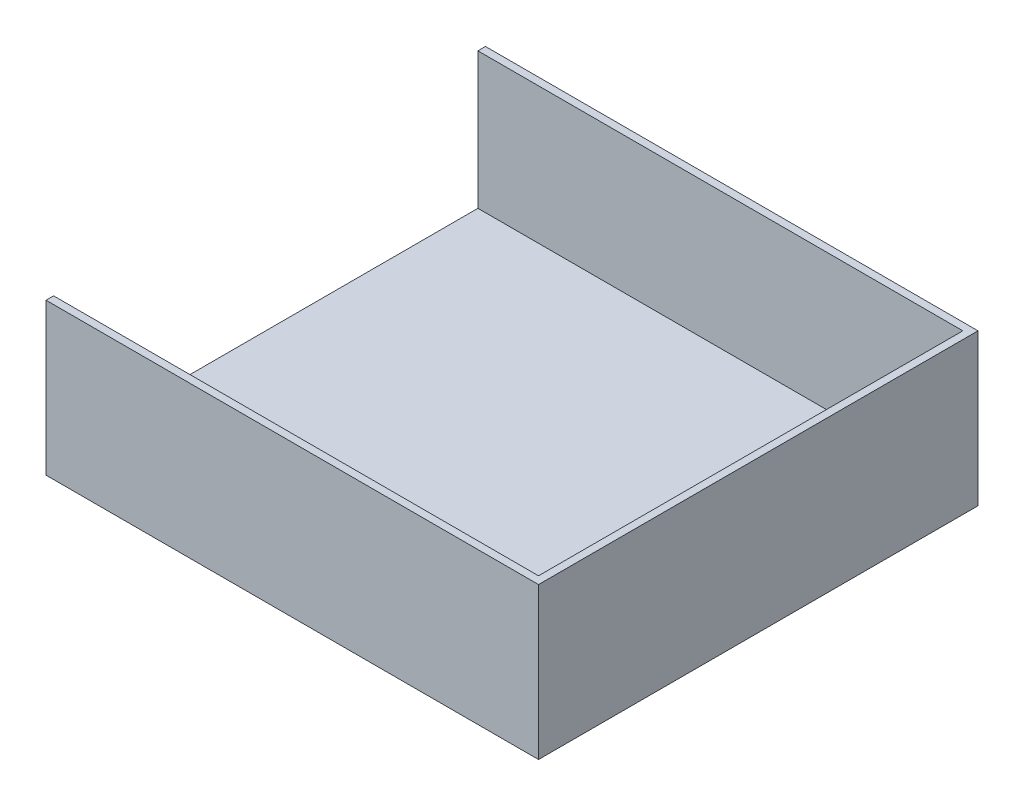
ISO-10303-21;
HEADER;
FILE_DESCRIPTION(('STEP AP214'),'2;1');
FILE_NAME('part.step','',(''),(''),'','','');
FILE_SCHEMA(('AUTOMOTIVE_DESIGN { 1 0 10303 214 1 1 1 1 }'));
ENDSEC;
DATA;
#1=APPLICATION_CONTEXT('core data for automotive mechanical design processes');
#2=APPLICATION_PROTOCOL_DEFINITION('international standard','automotive_design',2000,#1);
#3=PRODUCT_CONTEXT('',#1,'mechanical');
#4=PRODUCT('Part','Part','',(#3));
#5=PRODUCT_RELATED_PRODUCT_CATEGORY('part','',(#4));
#6=PRODUCT_DEFINITION_FORMATION('','',#4);
#7=PRODUCT_DEFINITION_CONTEXT('part definition',#1,'design');
#8=PRODUCT_DEFINITION('design','',#6,#7);
#9=PRODUCT_DEFINITION_SHAPE('','',#8);
#10=(LENGTH_UNIT() NAMED_UNIT(*) SI_UNIT(.MILLI.,.METRE.));
#11=(NAMED_UNIT(*) PLANE_ANGLE_UNIT() SI_UNIT($,.RADIAN.));
#12=(NAMED_UNIT(*) SI_UNIT($,.STERADIAN.) SOLID_ANGLE_UNIT());
#13=UNCERTAINTY_MEASURE_WITH_UNIT(LENGTH_MEASURE(1.E-05),#10,'distance_accuracy_value','');
#14=(GEOMETRIC_REPRESENTATION_CONTEXT(3) GLOBAL_UNCERTAINTY_ASSIGNED_CONTEXT((#13)) GLOBAL_UNIT_ASSIGNED_CONTEXT((#10,
#11,#12)) REPRESENTATION_CONTEXT('',''));
#15=CARTESIAN_POINT('',(0.,0.,0.));
#16=DIRECTION('',(0.,0.,1.));
#17=DIRECTION('',(1.,0.,0.));
#18=AXIS2_PLACEMENT_3D('',#15,#16,#17);
#19=CARTESIAN_POINT('',(0.,0.,0.));
#20=DIRECTION('',(1.,0.,0.));
#21=DIRECTION('',(0.,1.,0.));
#22=AXIS2_PLACEMENT_3D('',#19,#20,#21);
#23=PLANE('',#22);
#24=DIRECTION('',(0.,0.,1.));
#25=VECTOR('',#24,1.);
#26=CARTESIAN_POINT('',(0.,0.,0.));
#27=LINE('',#26,#25);
#28=CARTESIAN_POINT('',(0.,0.,-92.075));
#29=VERTEX_POINT('',#28);
#30=CARTESIAN_POINT('',(1.11022302462516E-13,0.,92.075));
#31=VERTEX_POINT('',#30);
#32=EDGE_CURVE('E45',#29,#31,#27,.T.);
#33=ORIENTED_EDGE('',*,*,#32,.T.);
#34=DIRECTION('',(0.,-1.,0.));
#35=VECTOR('',#34,1.);
#36=CARTESIAN_POINT('',(1.38777878078145E-13,63.4999999999997,92.075));
#37=LINE('',#36,#35);
#38=CARTESIAN_POINT('',(1.11022302462516E-13,63.5,92.075));
#39=VERTEX_POINT('',#38);
#40=EDGE_CURVE('E156',#39,#31,#37,.T.);
#41=ORIENTED_EDGE('',*,*,#40,.F.);
#42=DIRECTION('',(0.,0.,1.));
#43=VECTOR('',#42,1.);
#44=CARTESIAN_POINT('',(0.,63.5,0.));
#45=LINE('',#44,#43);
#46=CARTESIAN_POINT('',(1.11022302462516E-13,63.5,88.9));
#47=VERTEX_POINT('',#46);
#48=EDGE_CURVE('E162',#47,#39,#45,.T.);
#49=ORIENTED_EDGE('',*,*,#48,.F.);
#50=DIRECTION('',(0.,-1.,0.));
#51=VECTOR('',#50,1.);
#52=CARTESIAN_POINT('',(1.38777878078145E-13,63.4999999999997,88.9));
#53=LINE('',#52,#51);
#54=CARTESIAN_POINT('',(0.,6.35,88.9));
#55=VERTEX_POINT('',#54);
#56=EDGE_CURVE('E50',#47,#55,#53,.T.);
#57=ORIENTED_EDGE('',*,*,#56,.T.);
#58=DIRECTION('',(0.,0.,-1.));
#59=VECTOR('',#58,1.);
#60=CARTESIAN_POINT('',(0.,6.35,0.));
#61=LINE('',#60,#59);
#62=CARTESIAN_POINT('',(0.,6.35,-88.9));
#63=VERTEX_POINT('',#62);
#64=EDGE_CURVE('E11',#55,#63,#61,.T.);
#65=ORIENTED_EDGE('',*,*,#64,.T.);
#66=DIRECTION('',(0.,1.,0.));
#67=VECTOR('',#66,1.);
#68=CARTESIAN_POINT('',(0.,63.4999999999997,-88.9));
#69=LINE('',#68,#67);
#70=CARTESIAN_POINT('',(0.,63.5,-88.9));
#71=VERTEX_POINT('',#70);
#72=EDGE_CURVE('E64',#63,#71,#69,.T.);
#73=ORIENTED_EDGE('',*,*,#72,.T.);
#74=CARTESIAN_POINT('',(0.,63.5,-92.075));
#75=VERTEX_POINT('',#74);
#76=EDGE_CURVE('E160',#75,#71,#45,.T.);
#77=ORIENTED_EDGE('',*,*,#76,.F.);
#78=DIRECTION('',(0.,1.,0.));
#79=VECTOR('',#78,1.);
#80=CARTESIAN_POINT('',(0.,63.4999999999997,-92.075));
#81=LINE('',#80,#79);
#82=EDGE_CURVE('E163',#29,#75,#81,.T.);
#83=ORIENTED_EDGE('',*,*,#82,.F.);
#84=EDGE_LOOP('',(#33,#41,#49,#57,#65,#73,#77,#83));
#85=FACE_BOUND('',#84,.T.);
#86=ADVANCED_FACE('F42',(#85),#23,.F.);
#87=CARTESIAN_POINT('',(0.,63.5,0.));
#88=DIRECTION('',(0.,-1.,0.));
#89=DIRECTION('',(0.,0.,-1.));
#90=AXIS2_PLACEMENT_3D('',#87,#88,#89);
#91=PLANE('',#90);
#92=DIRECTION('',(-1.,0.,0.));
#93=VECTOR('',#92,1.);
#94=CARTESIAN_POINT('',(-206.375,63.5,-92.075));
#95=LINE('',#94,#93);
#96=CARTESIAN_POINT('',(206.375,63.5,-92.075));
#97=VERTEX_POINT('',#96);
#98=EDGE_CURVE('E139',#97,#75,#95,.T.);
#99=ORIENTED_EDGE('',*,*,#98,.T.);
#100=ORIENTED_EDGE('',*,*,#76,.T.);
#101=DIRECTION('',(-1.,0.,0.));
#102=VECTOR('',#101,1.);
#103=CARTESIAN_POINT('',(-203.2,63.5,-88.9));
#104=LINE('',#103,#102);
#105=CARTESIAN_POINT('',(203.2,63.5,-88.9));
#106=VERTEX_POINT('',#105);
#107=EDGE_CURVE('E131',#106,#71,#104,.T.);
#108=ORIENTED_EDGE('',*,*,#107,.F.);
#109=DIRECTION('',(0.,0.,-1.));
#110=VECTOR('',#109,1.);
#111=CARTESIAN_POINT('',(203.2,63.5,88.9));
#112=LINE('',#111,#110);
#113=CARTESIAN_POINT('',(203.2,63.5,88.9));
#114=VERTEX_POINT('',#113);
#115=EDGE_CURVE('E127',#114,#106,#112,.T.);
#116=ORIENTED_EDGE('',*,*,#115,.F.);
#117=DIRECTION('',(1.,0.,0.));
#118=VECTOR('',#117,1.);
#119=CARTESIAN_POINT('',(-203.2,63.5,88.9));
#120=LINE('',#119,#118);
#121=EDGE_CURVE('E117',#47,#114,#120,.T.);
#122=ORIENTED_EDGE('',*,*,#121,.F.);
#123=ORIENTED_EDGE('',*,*,#48,.T.);
#124=DIRECTION('',(1.,0.,0.));
#125=VECTOR('',#124,1.);
#126=CARTESIAN_POINT('',(-206.375,63.5,92.075));
#127=LINE('',#126,#125);
#128=CARTESIAN_POINT('',(206.375,63.5,92.075));
#129=VERTEX_POINT('',#128);
#130=EDGE_CURVE('E143',#39,#129,#127,.T.);
#131=ORIENTED_EDGE('',*,*,#130,.T.);
#132=DIRECTION('',(0.,0.,-1.));
#133=VECTOR('',#132,1.);
#134=CARTESIAN_POINT('',(206.375,63.5,92.075));
#135=LINE('',#134,#133);
#136=EDGE_CURVE('E136',#129,#97,#135,.T.);
#137=ORIENTED_EDGE('',*,*,#136,.T.);
#138=EDGE_LOOP('',(#99,#100,#108,#116,#122,#123,#131,#137));
#139=FACE_BOUND('',#138,.T.);
#140=ADVANCED_FACE('F169',(#139),#91,.F.);
#141=CARTESIAN_POINT('',(0.,0.,0.));
#142=DIRECTION('',(0.,-1.,0.));
#143=DIRECTION('',(0.,0.,-1.));
#144=AXIS2_PLACEMENT_3D('',#141,#142,#143);
#145=PLANE('',#144);
#146=ORIENTED_EDGE('',*,*,#32,.F.);
#147=DIRECTION('',(-1.,0.,0.));
#148=VECTOR('',#147,1.);
#149=CARTESIAN_POINT('',(-206.375,0.,-92.075));
#150=LINE('',#149,#148);
#151=CARTESIAN_POINT('',(206.375,0.,-92.075));
#152=VERTEX_POINT('',#151);
#153=EDGE_CURVE('E148',#152,#29,#150,.T.);
#154=ORIENTED_EDGE('',*,*,#153,.F.);
#155=DIRECTION('',(0.,0.,-1.));
#156=VECTOR('',#155,1.);
#157=CARTESIAN_POINT('',(206.375,0.,92.075));
#158=LINE('',#157,#156);
#159=CARTESIAN_POINT('',(206.375,0.,92.075));
#160=VERTEX_POINT('',#159);
#161=EDGE_CURVE('E135',#160,#152,#158,.T.);
#162=ORIENTED_EDGE('',*,*,#161,.F.);
#163=DIRECTION('',(1.,0.,0.));
#164=VECTOR('',#163,1.);
#165=CARTESIAN_POINT('',(-206.375,0.,92.075));
#166=LINE('',#165,#164);
#167=EDGE_CURVE('E140',#31,#160,#166,.T.);
#168=ORIENTED_EDGE('',*,*,#167,.F.);
#169=EDGE_LOOP('',(#146,#154,#162,#168));
#170=FACE_BOUND('',#169,.T.);
#171=ADVANCED_FACE('F186',(#170),#145,.T.);
#172=CARTESIAN_POINT('',(206.375,63.5,92.075));
#173=DIRECTION('',(-1.,0.,0.));
#174=DIRECTION('',(0.,0.,1.));
#175=AXIS2_PLACEMENT_3D('',#172,#173,#174);
#176=PLANE('',#175);
#177=ORIENTED_EDGE('',*,*,#161,.T.);
#178=DIRECTION('',(0.,-1.,0.));
#179=VECTOR('',#178,1.);
#180=CARTESIAN_POINT('',(206.375,63.5,-92.075));
#181=LINE('',#180,#179);
#182=EDGE_CURVE('E154',#97,#152,#181,.T.);
#183=ORIENTED_EDGE('',*,*,#182,.F.);
#184=ORIENTED_EDGE('',*,*,#136,.F.);
#185=DIRECTION('',(0.,-1.,0.));
#186=VECTOR('',#185,1.);
#187=CARTESIAN_POINT('',(206.375,63.5,92.075));
#188=LINE('',#187,#186);
#189=EDGE_CURVE('E145',#129,#160,#188,.T.);
#190=ORIENTED_EDGE('',*,*,#189,.T.);
#191=EDGE_LOOP('',(#177,#183,#184,#190));
#192=FACE_BOUND('',#191,.T.);
#193=ADVANCED_FACE('F182',(#192),#176,.F.);
#194=CARTESIAN_POINT('',(-206.375,63.5,-92.075));
#195=DIRECTION('',(0.,0.,1.));
#196=DIRECTION('',(1.,0.,0.));
#197=AXIS2_PLACEMENT_3D('',#194,#195,#196);
#198=PLANE('',#197);
#199=ORIENTED_EDGE('',*,*,#153,.T.);
#200=ORIENTED_EDGE('',*,*,#82,.T.);
#201=ORIENTED_EDGE('',*,*,#98,.F.);
#202=ORIENTED_EDGE('',*,*,#182,.T.);
#203=EDGE_LOOP('',(#199,#200,#201,#202));
#204=FACE_BOUND('',#203,.T.);
#205=ADVANCED_FACE('F184',(#204),#198,.F.);
#206=CARTESIAN_POINT('',(-206.375,63.5,92.075));
#207=DIRECTION('',(0.,0.,-1.));
#208=DIRECTION('',(-1.,0.,0.));
#209=AXIS2_PLACEMENT_3D('',#206,#207,#208);
#210=PLANE('',#209);
#211=ORIENTED_EDGE('',*,*,#130,.F.);
#212=ORIENTED_EDGE('',*,*,#40,.T.);
#213=ORIENTED_EDGE('',*,*,#167,.T.);
#214=ORIENTED_EDGE('',*,*,#189,.F.);
#215=EDGE_LOOP('',(#211,#212,#213,#214));
#216=FACE_BOUND('',#215,.T.);
#217=ADVANCED_FACE('F177',(#216),#210,.F.);
#218=CARTESIAN_POINT('',(203.2,63.5,88.9));
#219=DIRECTION('',(-1.,0.,0.));
#220=DIRECTION('',(0.,0.,1.));
#221=AXIS2_PLACEMENT_3D('',#218,#219,#220);
#222=PLANE('',#221);
#223=DIRECTION('',(0.,0.,-1.));
#224=VECTOR('',#223,1.);
#225=CARTESIAN_POINT('',(203.2,6.35,0.));
#226=LINE('',#225,#224);
#227=CARTESIAN_POINT('',(203.2,6.35,88.9));
#228=VERTEX_POINT('',#227);
#229=CARTESIAN_POINT('',(203.2,6.35,-88.9));
#230=VERTEX_POINT('',#229);
#231=EDGE_CURVE('E110',#228,#230,#226,.T.);
#232=ORIENTED_EDGE('',*,*,#231,.F.);
#233=DIRECTION('',(0.,-1.,0.));
#234=VECTOR('',#233,1.);
#235=CARTESIAN_POINT('',(203.2,63.5,88.9));
#236=LINE('',#235,#234);
#237=EDGE_CURVE('E114',#114,#228,#236,.T.);
#238=ORIENTED_EDGE('',*,*,#237,.F.);
#239=ORIENTED_EDGE('',*,*,#115,.T.);
#240=DIRECTION('',(0.,-1.,0.));
#241=VECTOR('',#240,1.);
#242=CARTESIAN_POINT('',(203.2,63.5,-88.9));
#243=LINE('',#242,#241);
#244=EDGE_CURVE('E120',#106,#230,#243,.T.);
#245=ORIENTED_EDGE('',*,*,#244,.T.);
#246=EDGE_LOOP('',(#232,#238,#239,#245));
#247=FACE_BOUND('',#246,.T.);
#248=ADVANCED_FACE('F123',(#247),#222,.T.);
#249=CARTESIAN_POINT('',(-203.2,63.5,-88.9));
#250=DIRECTION('',(0.,0.,1.));
#251=DIRECTION('',(1.,0.,0.));
#252=AXIS2_PLACEMENT_3D('',#249,#250,#251);
#253=PLANE('',#252);
#254=ORIENTED_EDGE('',*,*,#72,.F.);
#255=DIRECTION('',(1.,0.,0.));
#256=VECTOR('',#255,1.);
#257=CARTESIAN_POINT('',(0.,6.35,-88.9));
#258=LINE('',#257,#256);
#259=EDGE_CURVE('E125',#63,#230,#258,.T.);
#260=ORIENTED_EDGE('',*,*,#259,.T.);
#261=ORIENTED_EDGE('',*,*,#244,.F.);
#262=ORIENTED_EDGE('',*,*,#107,.T.);
#263=EDGE_LOOP('',(#254,#260,#261,#262));
#264=FACE_BOUND('',#263,.T.);
#265=ADVANCED_FACE('F205',(#264),#253,.T.);
#266=CARTESIAN_POINT('',(-203.2,63.5,88.9));
#267=DIRECTION('',(0.,0.,-1.));
#268=DIRECTION('',(-1.,0.,0.));
#269=AXIS2_PLACEMENT_3D('',#266,#267,#268);
#270=PLANE('',#269);
#271=ORIENTED_EDGE('',*,*,#56,.F.);
#272=ORIENTED_EDGE('',*,*,#121,.T.);
#273=ORIENTED_EDGE('',*,*,#237,.T.);
#274=DIRECTION('',(1.,0.,0.));
#275=VECTOR('',#274,1.);
#276=CARTESIAN_POINT('',(0.,6.35,88.9));
#277=LINE('',#276,#275);
#278=EDGE_CURVE('E106',#55,#228,#277,.T.);
#279=ORIENTED_EDGE('',*,*,#278,.F.);
#280=EDGE_LOOP('',(#271,#272,#273,#279));
#281=FACE_BOUND('',#280,.T.);
#282=ADVANCED_FACE('F115',(#281),#270,.T.);
#283=CARTESIAN_POINT('',(0.,6.35,0.));
#284=DIRECTION('',(0.,1.,0.));
#285=DIRECTION('',(0.,0.,1.));
#286=AXIS2_PLACEMENT_3D('',#283,#284,#285);
#287=PLANE('',#286);
#288=ORIENTED_EDGE('',*,*,#64,.F.);
#289=ORIENTED_EDGE('',*,*,#278,.T.);
#290=ORIENTED_EDGE('',*,*,#231,.T.);
#291=ORIENTED_EDGE('',*,*,#259,.F.);
#292=EDGE_LOOP('',(#288,#289,#290,#291));
#293=FACE_BOUND('',#292,.T.);
#294=ADVANCED_FACE('F108',(#293),#287,.T.);
#295=CLOSED_SHELL('',(#86,#140,#171,#193,#205,#217,#248,#265,#282,#294));
#296=MANIFOLD_SOLID_BREP('B2',#295);
#297=ADVANCED_BREP_SHAPE_REPRESENTATION('',(#18,#296),#14);
#298=SHAPE_DEFINITION_REPRESENTATION(#9,#297);
ENDSEC;
END-ISO-10303-21;
